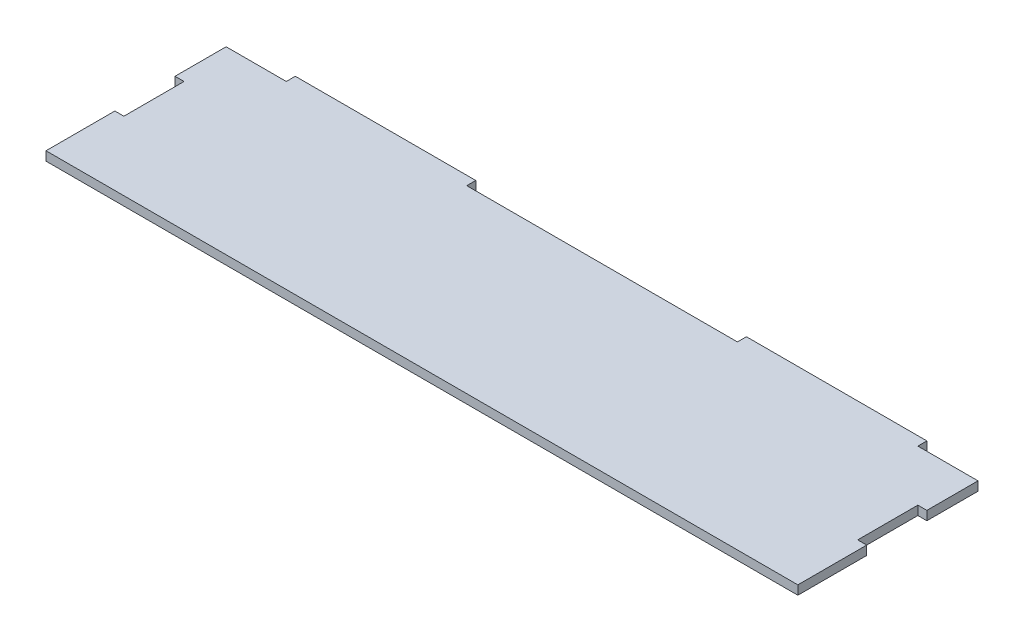
ISO-10303-21;
HEADER;
FILE_DESCRIPTION(('STEP AP214'),'2;1');
FILE_NAME('part.step','',(''),(''),'','','');
FILE_SCHEMA(('AUTOMOTIVE_DESIGN { 1 0 10303 214 1 1 1 1 }'));
ENDSEC;
DATA;
#1=APPLICATION_CONTEXT('core data for automotive mechanical design processes');
#2=APPLICATION_PROTOCOL_DEFINITION('international standard','automotive_design',2000,#1);
#3=PRODUCT_CONTEXT('',#1,'mechanical');
#4=PRODUCT('Part','Part','',(#3));
#5=PRODUCT_RELATED_PRODUCT_CATEGORY('part','',(#4));
#6=PRODUCT_DEFINITION_FORMATION('','',#4);
#7=PRODUCT_DEFINITION_CONTEXT('part definition',#1,'design');
#8=PRODUCT_DEFINITION('design','',#6,#7);
#9=PRODUCT_DEFINITION_SHAPE('','',#8);
#10=(LENGTH_UNIT() NAMED_UNIT(*) SI_UNIT(.MILLI.,.METRE.));
#11=(NAMED_UNIT(*) PLANE_ANGLE_UNIT() SI_UNIT($,.RADIAN.));
#12=(NAMED_UNIT(*) SI_UNIT($,.STERADIAN.) SOLID_ANGLE_UNIT());
#13=UNCERTAINTY_MEASURE_WITH_UNIT(LENGTH_MEASURE(1.E-05),#10,'distance_accuracy_value','');
#14=(GEOMETRIC_REPRESENTATION_CONTEXT(3) GLOBAL_UNCERTAINTY_ASSIGNED_CONTEXT((#13)) GLOBAL_UNIT_ASSIGNED_CONTEXT((#10,
#11,#12)) REPRESENTATION_CONTEXT('',''));
#15=CARTESIAN_POINT('',(0.,0.,0.));
#16=DIRECTION('',(0.,0.,1.));
#17=DIRECTION('',(1.,0.,0.));
#18=AXIS2_PLACEMENT_3D('',#15,#16,#17);
#19=CARTESIAN_POINT('',(0.,3.,-62.9));
#20=DIRECTION('',(0.,0.,1.));
#21=DIRECTION('',(1.,0.,0.));
#22=AXIS2_PLACEMENT_3D('',#19,#20,#21);
#23=PLANE('',#22);
#24=DIRECTION('',(-1.,0.,0.));
#25=VECTOR('',#24,1.);
#26=CARTESIAN_POINT('',(0.,3.,-62.9));
#27=LINE('',#26,#25);
#28=CARTESIAN_POINT('',(80.,3.,-62.9));
#29=VERTEX_POINT('',#28);
#30=CARTESIAN_POINT('',(20.,3.,-62.9));
#31=VERTEX_POINT('',#30);
#32=EDGE_CURVE('E209',#29,#31,#27,.T.);
#33=ORIENTED_EDGE('',*,*,#32,.F.);
#34=DIRECTION('',(0.,1.,0.));
#35=VECTOR('',#34,1.);
#36=CARTESIAN_POINT('',(80.,-0.00100000000000013,-62.9));
#37=LINE('',#36,#35);
#38=CARTESIAN_POINT('',(80.,0.,-62.9));
#39=VERTEX_POINT('',#38);
#40=EDGE_CURVE('E180',#39,#29,#37,.T.);
#41=ORIENTED_EDGE('',*,*,#40,.F.);
#42=DIRECTION('',(-1.,0.,0.));
#43=VECTOR('',#42,1.);
#44=CARTESIAN_POINT('',(0.,0.,-62.9));
#45=LINE('',#44,#43);
#46=CARTESIAN_POINT('',(20.,0.,-62.9));
#47=VERTEX_POINT('',#46);
#48=EDGE_CURVE('E195',#39,#47,#45,.T.);
#49=ORIENTED_EDGE('',*,*,#48,.T.);
#50=DIRECTION('',(0.,1.,0.));
#51=VECTOR('',#50,1.);
#52=CARTESIAN_POINT('',(20.,-0.00100000000000013,-62.9));
#53=LINE('',#52,#51);
#54=EDGE_CURVE('E325',#47,#31,#53,.T.);
#55=ORIENTED_EDGE('',*,*,#54,.T.);
#56=EDGE_LOOP('',(#33,#41,#49,#55));
#57=FACE_BOUND('',#56,.T.);
#58=ADVANCED_FACE('F33',(#57),#23,.F.);
#59=CARTESIAN_POINT('',(250.,3.,0.));
#60=DIRECTION('',(-1.,0.,0.));
#61=DIRECTION('',(0.,0.,1.));
#62=AXIS2_PLACEMENT_3D('',#59,#60,#61);
#63=PLANE('',#62);
#64=DIRECTION('',(0.,0.,-1.));
#65=VECTOR('',#64,1.);
#66=CARTESIAN_POINT('',(250.,0.,0.));
#67=LINE('',#66,#65);
#68=CARTESIAN_POINT('',(250.,0.,0.));
#69=VERTEX_POINT('',#68);
#70=CARTESIAN_POINT('',(250.,0.,-22.9));
#71=VERTEX_POINT('',#70);
#72=EDGE_CURVE('E199',#69,#71,#67,.T.);
#73=ORIENTED_EDGE('',*,*,#72,.T.);
#74=DIRECTION('',(0.,1.,0.));
#75=VECTOR('',#74,1.);
#76=CARTESIAN_POINT('',(250.,0.,-22.9));
#77=LINE('',#76,#75);
#78=CARTESIAN_POINT('',(250.,3.,-22.9));
#79=VERTEX_POINT('',#78);
#80=EDGE_CURVE('E230',#71,#79,#77,.T.);
#81=ORIENTED_EDGE('',*,*,#80,.T.);
#82=DIRECTION('',(0.,0.,-1.));
#83=VECTOR('',#82,1.);
#84=CARTESIAN_POINT('',(250.,3.,0.));
#85=LINE('',#84,#83);
#86=CARTESIAN_POINT('',(250.,3.,0.));
#87=VERTEX_POINT('',#86);
#88=EDGE_CURVE('E213',#87,#79,#85,.T.);
#89=ORIENTED_EDGE('',*,*,#88,.F.);
#90=DIRECTION('',(0.,-1.,0.));
#91=VECTOR('',#90,1.);
#92=CARTESIAN_POINT('',(250.,3.,0.));
#93=LINE('',#92,#91);
#94=EDGE_CURVE('E41',#87,#69,#93,.T.);
#95=ORIENTED_EDGE('',*,*,#94,.T.);
#96=EDGE_LOOP('',(#73,#81,#89,#95));
#97=FACE_BOUND('',#96,.T.);
#98=ADVANCED_FACE('F229',(#97),#63,.F.);
#99=CARTESIAN_POINT('',(0.,3.,0.));
#100=DIRECTION('',(1.,0.,0.));
#101=DIRECTION('',(0.,0.,-1.));
#102=AXIS2_PLACEMENT_3D('',#99,#100,#101);
#103=PLANE('',#102);
#104=DIRECTION('',(0.,0.,1.));
#105=VECTOR('',#104,1.);
#106=CARTESIAN_POINT('',(0.,3.,0.));
#107=LINE('',#106,#105);
#108=CARTESIAN_POINT('',(0.,3.,-59.9));
#109=VERTEX_POINT('',#108);
#110=CARTESIAN_POINT('',(0.,3.,-42.9));
#111=VERTEX_POINT('',#110);
#112=EDGE_CURVE('E197',#109,#111,#107,.T.);
#113=ORIENTED_EDGE('',*,*,#112,.F.);
#114=DIRECTION('',(0.,1.,0.));
#115=VECTOR('',#114,1.);
#116=CARTESIAN_POINT('',(0.,-0.00100000000000013,-59.9));
#117=LINE('',#116,#115);
#118=CARTESIAN_POINT('',(0.,0.,-59.9));
#119=VERTEX_POINT('',#118);
#120=EDGE_CURVE('E324',#119,#109,#117,.T.);
#121=ORIENTED_EDGE('',*,*,#120,.F.);
#122=DIRECTION('',(0.,0.,1.));
#123=VECTOR('',#122,1.);
#124=CARTESIAN_POINT('',(0.,0.,0.));
#125=LINE('',#124,#123);
#126=CARTESIAN_POINT('',(0.,0.,-42.9));
#127=VERTEX_POINT('',#126);
#128=EDGE_CURVE('E217',#119,#127,#125,.T.);
#129=ORIENTED_EDGE('',*,*,#128,.T.);
#130=DIRECTION('',(0.,1.,0.));
#131=VECTOR('',#130,1.);
#132=CARTESIAN_POINT('',(0.,0.,-42.9));
#133=LINE('',#132,#131);
#134=EDGE_CURVE('E280',#127,#111,#133,.T.);
#135=ORIENTED_EDGE('',*,*,#134,.T.);
#136=EDGE_LOOP('',(#113,#121,#129,#135));
#137=FACE_BOUND('',#136,.T.);
#138=ADVANCED_FACE('F369',(#137),#103,.F.);
#139=CARTESIAN_POINT('',(0.,3.,-22.9));
#140=VERTEX_POINT('',#139);
#141=CARTESIAN_POINT('',(0.,3.,0.));
#142=VERTEX_POINT('',#141);
#143=EDGE_CURVE('E194',#140,#142,#107,.T.);
#144=ORIENTED_EDGE('',*,*,#143,.F.);
#145=DIRECTION('',(0.,1.,0.));
#146=VECTOR('',#145,1.);
#147=CARTESIAN_POINT('',(0.,0.,-22.9));
#148=LINE('',#147,#146);
#149=CARTESIAN_POINT('',(0.,0.,-22.9));
#150=VERTEX_POINT('',#149);
#151=EDGE_CURVE('E272',#150,#140,#148,.T.);
#152=ORIENTED_EDGE('',*,*,#151,.F.);
#153=CARTESIAN_POINT('',(0.,0.,0.));
#154=VERTEX_POINT('',#153);
#155=EDGE_CURVE('E219',#150,#154,#125,.T.);
#156=ORIENTED_EDGE('',*,*,#155,.T.);
#157=DIRECTION('',(0.,-1.,0.));
#158=VECTOR('',#157,1.);
#159=CARTESIAN_POINT('',(0.,3.,0.));
#160=LINE('',#159,#158);
#161=EDGE_CURVE('E11',#142,#154,#160,.T.);
#162=ORIENTED_EDGE('',*,*,#161,.F.);
#163=EDGE_LOOP('',(#144,#152,#156,#162));
#164=FACE_BOUND('',#163,.T.);
#165=ADVANCED_FACE('F35',(#164),#103,.F.);
#166=CARTESIAN_POINT('',(0.,3.,0.));
#167=DIRECTION('',(0.,0.,-1.));
#168=DIRECTION('',(-1.,0.,0.));
#169=AXIS2_PLACEMENT_3D('',#166,#167,#168);
#170=PLANE('',#169);
#171=DIRECTION('',(1.,0.,0.));
#172=VECTOR('',#171,1.);
#173=CARTESIAN_POINT('',(0.,0.,0.));
#174=LINE('',#173,#172);
#175=EDGE_CURVE('E218',#154,#69,#174,.T.);
#176=ORIENTED_EDGE('',*,*,#175,.T.);
#177=ORIENTED_EDGE('',*,*,#94,.F.);
#178=DIRECTION('',(1.,0.,0.));
#179=VECTOR('',#178,1.);
#180=CARTESIAN_POINT('',(0.,3.,0.));
#181=LINE('',#180,#179);
#182=EDGE_CURVE('E287',#142,#87,#181,.T.);
#183=ORIENTED_EDGE('',*,*,#182,.F.);
#184=ORIENTED_EDGE('',*,*,#161,.T.);
#185=EDGE_LOOP('',(#176,#177,#183,#184));
#186=FACE_BOUND('',#185,.T.);
#187=ADVANCED_FACE('F386',(#186),#170,.F.);
#188=CARTESIAN_POINT('',(250.,0.,-42.9));
#189=VERTEX_POINT('',#188);
#190=CARTESIAN_POINT('',(250.,0.,-59.9));
#191=VERTEX_POINT('',#190);
#192=EDGE_CURVE('E220',#189,#191,#67,.T.);
#193=ORIENTED_EDGE('',*,*,#192,.T.);
#194=DIRECTION('',(0.,1.,0.));
#195=VECTOR('',#194,1.);
#196=CARTESIAN_POINT('',(250.,-0.00100000000000013,-59.9));
#197=LINE('',#196,#195);
#198=CARTESIAN_POINT('',(250.,3.,-59.9));
#199=VERTEX_POINT('',#198);
#200=EDGE_CURVE('E305',#191,#199,#197,.T.);
#201=ORIENTED_EDGE('',*,*,#200,.T.);
#202=CARTESIAN_POINT('',(250.,3.,-42.9));
#203=VERTEX_POINT('',#202);
#204=EDGE_CURVE('E288',#203,#199,#85,.T.);
#205=ORIENTED_EDGE('',*,*,#204,.F.);
#206=DIRECTION('',(0.,1.,0.));
#207=VECTOR('',#206,1.);
#208=CARTESIAN_POINT('',(250.,0.,-42.9));
#209=LINE('',#208,#207);
#210=EDGE_CURVE('E240',#189,#203,#209,.T.);
#211=ORIENTED_EDGE('',*,*,#210,.F.);
#212=EDGE_LOOP('',(#193,#201,#205,#211));
#213=FACE_BOUND('',#212,.T.);
#214=ADVANCED_FACE('F304',(#213),#63,.F.);
#215=CARTESIAN_POINT('',(230.,0.,-62.9));
#216=VERTEX_POINT('',#215);
#217=CARTESIAN_POINT('',(170.,0.,-62.9));
#218=VERTEX_POINT('',#217);
#219=EDGE_CURVE('E187',#216,#218,#45,.T.);
#220=ORIENTED_EDGE('',*,*,#219,.T.);
#221=DIRECTION('',(0.,1.,0.));
#222=VECTOR('',#221,1.);
#223=CARTESIAN_POINT('',(170.,-0.00100000000000013,-62.9));
#224=LINE('',#223,#222);
#225=CARTESIAN_POINT('',(170.,3.,-62.9));
#226=VERTEX_POINT('',#225);
#227=EDGE_CURVE('E169',#218,#226,#224,.T.);
#228=ORIENTED_EDGE('',*,*,#227,.T.);
#229=CARTESIAN_POINT('',(230.,3.,-62.9));
#230=VERTEX_POINT('',#229);
#231=EDGE_CURVE('E203',#230,#226,#27,.T.);
#232=ORIENTED_EDGE('',*,*,#231,.F.);
#233=DIRECTION('',(0.,1.,0.));
#234=VECTOR('',#233,1.);
#235=CARTESIAN_POINT('',(230.,-0.00100000000000013,-62.9));
#236=LINE('',#235,#234);
#237=EDGE_CURVE('E193',#216,#230,#236,.T.);
#238=ORIENTED_EDGE('',*,*,#237,.F.);
#239=EDGE_LOOP('',(#220,#228,#232,#238));
#240=FACE_BOUND('',#239,.T.);
#241=ADVANCED_FACE('F192',(#240),#23,.F.);
#242=CARTESIAN_POINT('',(0.,3.,0.));
#243=DIRECTION('',(0.,-1.,0.));
#244=DIRECTION('',(0.,0.,-1.));
#245=AXIS2_PLACEMENT_3D('',#242,#243,#244);
#246=PLANE('',#245);
#247=DIRECTION('',(1.,0.,0.));
#248=VECTOR('',#247,1.);
#249=CARTESIAN_POINT('',(80.,3.,-59.9));
#250=LINE('',#249,#248);
#251=CARTESIAN_POINT('',(80.,3.,-59.9));
#252=VERTEX_POINT('',#251);
#253=CARTESIAN_POINT('',(170.,3.,-59.9));
#254=VERTEX_POINT('',#253);
#255=EDGE_CURVE('E344',#252,#254,#250,.T.);
#256=ORIENTED_EDGE('',*,*,#255,.F.);
#257=DIRECTION('',(0.,0.,1.));
#258=VECTOR('',#257,1.);
#259=CARTESIAN_POINT('',(80.,3.,-62.9));
#260=LINE('',#259,#258);
#261=EDGE_CURVE('E346',#29,#252,#260,.T.);
#262=ORIENTED_EDGE('',*,*,#261,.F.);
#263=ORIENTED_EDGE('',*,*,#32,.T.);
#264=DIRECTION('',(0.,0.,-1.));
#265=VECTOR('',#264,1.);
#266=CARTESIAN_POINT('',(20.,3.,-62.9));
#267=LINE('',#266,#265);
#268=CARTESIAN_POINT('',(20.,3.,-59.9));
#269=VERTEX_POINT('',#268);
#270=EDGE_CURVE('E321',#269,#31,#267,.T.);
#271=ORIENTED_EDGE('',*,*,#270,.F.);
#272=DIRECTION('',(1.,0.,0.));
#273=VECTOR('',#272,1.);
#274=CARTESIAN_POINT('',(0.,3.,-59.9));
#275=LINE('',#274,#273);
#276=EDGE_CURVE('E311',#109,#269,#275,.T.);
#277=ORIENTED_EDGE('',*,*,#276,.F.);
#278=ORIENTED_EDGE('',*,*,#112,.T.);
#279=DIRECTION('',(-1.,0.,0.));
#280=VECTOR('',#279,1.);
#281=CARTESIAN_POINT('',(0.,3.,-42.9));
#282=LINE('',#281,#280);
#283=CARTESIAN_POINT('',(3.,3.,-42.9));
#284=VERTEX_POINT('',#283);
#285=EDGE_CURVE('E266',#284,#111,#282,.T.);
#286=ORIENTED_EDGE('',*,*,#285,.F.);
#287=DIRECTION('',(0.,0.,-1.));
#288=VECTOR('',#287,1.);
#289=CARTESIAN_POINT('',(3.,3.,-42.9));
#290=LINE('',#289,#288);
#291=CARTESIAN_POINT('',(3.,3.,-22.9));
#292=VERTEX_POINT('',#291);
#293=EDGE_CURVE('E275',#292,#284,#290,.T.);
#294=ORIENTED_EDGE('',*,*,#293,.F.);
#295=DIRECTION('',(1.,0.,0.));
#296=VECTOR('',#295,1.);
#297=CARTESIAN_POINT('',(0.,3.,-22.9));
#298=LINE('',#297,#296);
#299=EDGE_CURVE('E258',#140,#292,#298,.T.);
#300=ORIENTED_EDGE('',*,*,#299,.F.);
#301=ORIENTED_EDGE('',*,*,#143,.T.);
#302=ORIENTED_EDGE('',*,*,#182,.T.);
#303=ORIENTED_EDGE('',*,*,#88,.T.);
#304=DIRECTION('',(1.,0.,0.));
#305=VECTOR('',#304,1.);
#306=CARTESIAN_POINT('',(250.,3.,-22.9));
#307=LINE('',#306,#305);
#308=CARTESIAN_POINT('',(247.,3.,-22.9));
#309=VERTEX_POINT('',#308);
#310=EDGE_CURVE('E255',#309,#79,#307,.T.);
#311=ORIENTED_EDGE('',*,*,#310,.F.);
#312=DIRECTION('',(0.,0.,1.));
#313=VECTOR('',#312,1.);
#314=CARTESIAN_POINT('',(247.,3.,-42.9));
#315=LINE('',#314,#313);
#316=CARTESIAN_POINT('',(247.,3.,-42.9));
#317=VERTEX_POINT('',#316);
#318=EDGE_CURVE('E251',#317,#309,#315,.T.);
#319=ORIENTED_EDGE('',*,*,#318,.F.);
#320=DIRECTION('',(-1.,0.,0.));
#321=VECTOR('',#320,1.);
#322=CARTESIAN_POINT('',(250.,3.,-42.9));
#323=LINE('',#322,#321);
#324=EDGE_CURVE('E248',#203,#317,#323,.T.);
#325=ORIENTED_EDGE('',*,*,#324,.F.);
#326=ORIENTED_EDGE('',*,*,#204,.T.);
#327=DIRECTION('',(1.,0.,0.));
#328=VECTOR('',#327,1.);
#329=CARTESIAN_POINT('',(250.,3.,-59.9));
#330=LINE('',#329,#328);
#331=CARTESIAN_POINT('',(230.,3.,-59.9));
#332=VERTEX_POINT('',#331);
#333=EDGE_CURVE('E315',#332,#199,#330,.T.);
#334=ORIENTED_EDGE('',*,*,#333,.F.);
#335=DIRECTION('',(0.,0.,1.));
#336=VECTOR('',#335,1.);
#337=CARTESIAN_POINT('',(230.,3.,-62.9));
#338=LINE('',#337,#336);
#339=EDGE_CURVE('E334',#230,#332,#338,.T.);
#340=ORIENTED_EDGE('',*,*,#339,.F.);
#341=ORIENTED_EDGE('',*,*,#231,.T.);
#342=DIRECTION('',(0.,0.,-1.));
#343=VECTOR('',#342,1.);
#344=CARTESIAN_POINT('',(170.,3.,-62.9));
#345=LINE('',#344,#343);
#346=EDGE_CURVE('E175',#254,#226,#345,.T.);
#347=ORIENTED_EDGE('',*,*,#346,.F.);
#348=EDGE_LOOP('',(#256,#262,#263,#271,#277,#278,#286,#294,#300,#301,#302,#303,#311,#319,#325,
#326,#334,#340,#341,#347));
#349=FACE_BOUND('',#348,.T.);
#350=ADVANCED_FACE('F296',(#349),#246,.F.);
#351=CARTESIAN_POINT('',(0.,0.,0.));
#352=DIRECTION('',(0.,-1.,0.));
#353=DIRECTION('',(0.,0.,-1.));
#354=AXIS2_PLACEMENT_3D('',#351,#352,#353);
#355=PLANE('',#354);
#356=DIRECTION('',(0.,0.,1.));
#357=VECTOR('',#356,1.);
#358=CARTESIAN_POINT('',(80.,0.,-62.9));
#359=LINE('',#358,#357);
#360=CARTESIAN_POINT('',(80.,0.,-59.9));
#361=VERTEX_POINT('',#360);
#362=EDGE_CURVE('E189',#39,#361,#359,.T.);
#363=ORIENTED_EDGE('',*,*,#362,.T.);
#364=DIRECTION('',(1.,0.,0.));
#365=VECTOR('',#364,1.);
#366=CARTESIAN_POINT('',(80.,0.,-59.9));
#367=LINE('',#366,#365);
#368=CARTESIAN_POINT('',(170.,0.,-59.9));
#369=VERTEX_POINT('',#368);
#370=EDGE_CURVE('E188',#361,#369,#367,.T.);
#371=ORIENTED_EDGE('',*,*,#370,.T.);
#372=DIRECTION('',(0.,0.,-1.));
#373=VECTOR('',#372,1.);
#374=CARTESIAN_POINT('',(170.,0.,-62.9));
#375=LINE('',#374,#373);
#376=EDGE_CURVE('E172',#369,#218,#375,.T.);
#377=ORIENTED_EDGE('',*,*,#376,.T.);
#378=ORIENTED_EDGE('',*,*,#219,.F.);
#379=DIRECTION('',(0.,0.,1.));
#380=VECTOR('',#379,1.);
#381=CARTESIAN_POINT('',(230.,0.,-62.9));
#382=LINE('',#381,#380);
#383=CARTESIAN_POINT('',(230.,0.,-59.9));
#384=VERTEX_POINT('',#383);
#385=EDGE_CURVE('E333',#216,#384,#382,.T.);
#386=ORIENTED_EDGE('',*,*,#385,.T.);
#387=DIRECTION('',(1.,0.,0.));
#388=VECTOR('',#387,1.);
#389=CARTESIAN_POINT('',(250.,0.,-59.9));
#390=LINE('',#389,#388);
#391=EDGE_CURVE('E332',#384,#191,#390,.T.);
#392=ORIENTED_EDGE('',*,*,#391,.T.);
#393=ORIENTED_EDGE('',*,*,#192,.F.);
#394=DIRECTION('',(-1.,0.,0.));
#395=VECTOR('',#394,1.);
#396=CARTESIAN_POINT('',(250.,0.,-42.9));
#397=LINE('',#396,#395);
#398=CARTESIAN_POINT('',(247.,0.,-42.9));
#399=VERTEX_POINT('',#398);
#400=EDGE_CURVE('E244',#189,#399,#397,.T.);
#401=ORIENTED_EDGE('',*,*,#400,.T.);
#402=DIRECTION('',(0.,0.,1.));
#403=VECTOR('',#402,1.);
#404=CARTESIAN_POINT('',(247.,0.,-42.9));
#405=LINE('',#404,#403);
#406=CARTESIAN_POINT('',(247.,0.,-22.9));
#407=VERTEX_POINT('',#406);
#408=EDGE_CURVE('E238',#399,#407,#405,.T.);
#409=ORIENTED_EDGE('',*,*,#408,.T.);
#410=DIRECTION('',(1.,0.,0.));
#411=VECTOR('',#410,1.);
#412=CARTESIAN_POINT('',(250.,0.,-22.9));
#413=LINE('',#412,#411);
#414=EDGE_CURVE('E236',#407,#71,#413,.T.);
#415=ORIENTED_EDGE('',*,*,#414,.T.);
#416=ORIENTED_EDGE('',*,*,#72,.F.);
#417=ORIENTED_EDGE('',*,*,#175,.F.);
#418=ORIENTED_EDGE('',*,*,#155,.F.);
#419=DIRECTION('',(1.,0.,0.));
#420=VECTOR('',#419,1.);
#421=CARTESIAN_POINT('',(0.,0.,-22.9));
#422=LINE('',#421,#420);
#423=CARTESIAN_POINT('',(3.,0.,-22.9));
#424=VERTEX_POINT('',#423);
#425=EDGE_CURVE('E262',#150,#424,#422,.T.);
#426=ORIENTED_EDGE('',*,*,#425,.T.);
#427=DIRECTION('',(0.,0.,-1.));
#428=VECTOR('',#427,1.);
#429=CARTESIAN_POINT('',(3.,0.,-42.9));
#430=LINE('',#429,#428);
#431=CARTESIAN_POINT('',(3.,0.,-42.9));
#432=VERTEX_POINT('',#431);
#433=EDGE_CURVE('E265',#424,#432,#430,.T.);
#434=ORIENTED_EDGE('',*,*,#433,.T.);
#435=DIRECTION('',(-1.,0.,0.));
#436=VECTOR('',#435,1.);
#437=CARTESIAN_POINT('',(0.,0.,-42.9));
#438=LINE('',#437,#436);
#439=EDGE_CURVE('E269',#432,#127,#438,.T.);
#440=ORIENTED_EDGE('',*,*,#439,.T.);
#441=ORIENTED_EDGE('',*,*,#128,.F.);
#442=DIRECTION('',(1.,0.,0.));
#443=VECTOR('',#442,1.);
#444=CARTESIAN_POINT('',(0.,0.,-59.9));
#445=LINE('',#444,#443);
#446=CARTESIAN_POINT('',(20.,0.,-59.9));
#447=VERTEX_POINT('',#446);
#448=EDGE_CURVE('E252',#119,#447,#445,.T.);
#449=ORIENTED_EDGE('',*,*,#448,.T.);
#450=DIRECTION('',(0.,0.,-1.));
#451=VECTOR('',#450,1.);
#452=CARTESIAN_POINT('',(20.,0.,-62.9));
#453=LINE('',#452,#451);
#454=EDGE_CURVE('E308',#447,#47,#453,.T.);
#455=ORIENTED_EDGE('',*,*,#454,.T.);
#456=ORIENTED_EDGE('',*,*,#48,.F.);
#457=EDGE_LOOP('',(#363,#371,#377,#378,#386,#392,#393,#401,#409,#415,#416,#417,#418,#426,#434,
#440,#441,#449,#455,#456));
#458=FACE_BOUND('',#457,.T.);
#459=ADVANCED_FACE('F185',(#458),#355,.T.);
#460=CARTESIAN_POINT('',(0.,0.,-42.9));
#461=DIRECTION('',(0.,0.,-1.));
#462=DIRECTION('',(-1.,0.,0.));
#463=AXIS2_PLACEMENT_3D('',#460,#461,#462);
#464=PLANE('',#463);
#465=ORIENTED_EDGE('',*,*,#285,.T.);
#466=ORIENTED_EDGE('',*,*,#134,.F.);
#467=ORIENTED_EDGE('',*,*,#439,.F.);
#468=DIRECTION('',(0.,1.,0.));
#469=VECTOR('',#468,1.);
#470=CARTESIAN_POINT('',(3.,0.,-42.9));
#471=LINE('',#470,#469);
#472=EDGE_CURVE('E283',#432,#284,#471,.T.);
#473=ORIENTED_EDGE('',*,*,#472,.T.);
#474=EDGE_LOOP('',(#465,#466,#467,#473));
#475=FACE_BOUND('',#474,.T.);
#476=ADVANCED_FACE('F374',(#475),#464,.F.);
#477=CARTESIAN_POINT('',(3.,0.,-42.9));
#478=DIRECTION('',(1.,0.,0.));
#479=DIRECTION('',(0.,0.,-1.));
#480=AXIS2_PLACEMENT_3D('',#477,#478,#479);
#481=PLANE('',#480);
#482=ORIENTED_EDGE('',*,*,#293,.T.);
#483=ORIENTED_EDGE('',*,*,#472,.F.);
#484=ORIENTED_EDGE('',*,*,#433,.F.);
#485=DIRECTION('',(0.,1.,0.));
#486=VECTOR('',#485,1.);
#487=CARTESIAN_POINT('',(3.,0.,-22.9));
#488=LINE('',#487,#486);
#489=EDGE_CURVE('E285',#424,#292,#488,.T.);
#490=ORIENTED_EDGE('',*,*,#489,.T.);
#491=EDGE_LOOP('',(#482,#483,#484,#490));
#492=FACE_BOUND('',#491,.T.);
#493=ADVANCED_FACE('F377',(#492),#481,.F.);
#494=CARTESIAN_POINT('',(0.,0.,-22.9));
#495=DIRECTION('',(0.,0.,1.));
#496=DIRECTION('',(1.,0.,0.));
#497=AXIS2_PLACEMENT_3D('',#494,#495,#496);
#498=PLANE('',#497);
#499=ORIENTED_EDGE('',*,*,#299,.T.);
#500=ORIENTED_EDGE('',*,*,#489,.F.);
#501=ORIENTED_EDGE('',*,*,#425,.F.);
#502=ORIENTED_EDGE('',*,*,#151,.T.);
#503=EDGE_LOOP('',(#499,#500,#501,#502));
#504=FACE_BOUND('',#503,.T.);
#505=ADVANCED_FACE('F379',(#504),#498,.F.);
#506=CARTESIAN_POINT('',(250.,0.,-22.9));
#507=DIRECTION('',(0.,0.,1.));
#508=DIRECTION('',(1.,0.,0.));
#509=AXIS2_PLACEMENT_3D('',#506,#507,#508);
#510=PLANE('',#509);
#511=ORIENTED_EDGE('',*,*,#310,.T.);
#512=ORIENTED_EDGE('',*,*,#80,.F.);
#513=ORIENTED_EDGE('',*,*,#414,.F.);
#514=DIRECTION('',(0.,1.,0.));
#515=VECTOR('',#514,1.);
#516=CARTESIAN_POINT('',(247.,0.,-22.9));
#517=LINE('',#516,#515);
#518=EDGE_CURVE('E259',#407,#309,#517,.T.);
#519=ORIENTED_EDGE('',*,*,#518,.T.);
#520=EDGE_LOOP('',(#511,#512,#513,#519));
#521=FACE_BOUND('',#520,.T.);
#522=ADVANCED_FACE('F298',(#521),#510,.F.);
#523=CARTESIAN_POINT('',(247.,0.,-42.9));
#524=DIRECTION('',(-1.,0.,0.));
#525=DIRECTION('',(0.,0.,1.));
#526=AXIS2_PLACEMENT_3D('',#523,#524,#525);
#527=PLANE('',#526);
#528=ORIENTED_EDGE('',*,*,#318,.T.);
#529=ORIENTED_EDGE('',*,*,#518,.F.);
#530=ORIENTED_EDGE('',*,*,#408,.F.);
#531=DIRECTION('',(0.,1.,0.));
#532=VECTOR('',#531,1.);
#533=CARTESIAN_POINT('',(247.,0.,-42.9));
#534=LINE('',#533,#532);
#535=EDGE_CURVE('E242',#399,#317,#534,.T.);
#536=ORIENTED_EDGE('',*,*,#535,.T.);
#537=EDGE_LOOP('',(#528,#529,#530,#536));
#538=FACE_BOUND('',#537,.T.);
#539=ADVANCED_FACE('F300',(#538),#527,.F.);
#540=CARTESIAN_POINT('',(250.,0.,-42.9));
#541=DIRECTION('',(0.,0.,-1.));
#542=DIRECTION('',(-1.,0.,0.));
#543=AXIS2_PLACEMENT_3D('',#540,#541,#542);
#544=PLANE('',#543);
#545=ORIENTED_EDGE('',*,*,#324,.T.);
#546=ORIENTED_EDGE('',*,*,#535,.F.);
#547=ORIENTED_EDGE('',*,*,#400,.F.);
#548=ORIENTED_EDGE('',*,*,#210,.T.);
#549=EDGE_LOOP('',(#545,#546,#547,#548));
#550=FACE_BOUND('',#549,.T.);
#551=ADVANCED_FACE('F303',(#550),#544,.F.);
#552=CARTESIAN_POINT('',(20.,-0.00100000000000013,-62.9));
#553=DIRECTION('',(1.,0.,0.));
#554=DIRECTION('',(0.,0.,-1.));
#555=AXIS2_PLACEMENT_3D('',#552,#553,#554);
#556=PLANE('',#555);
#557=DIRECTION('',(0.,1.,0.));
#558=VECTOR('',#557,1.);
#559=CARTESIAN_POINT('',(20.,-0.00100000000000013,-59.9));
#560=LINE('',#559,#558);
#561=EDGE_CURVE('E328',#447,#269,#560,.T.);
#562=ORIENTED_EDGE('',*,*,#561,.T.);
#563=ORIENTED_EDGE('',*,*,#270,.T.);
#564=ORIENTED_EDGE('',*,*,#54,.F.);
#565=ORIENTED_EDGE('',*,*,#454,.F.);
#566=EDGE_LOOP('',(#562,#563,#564,#565));
#567=FACE_BOUND('',#566,.T.);
#568=ADVANCED_FACE('F361',(#567),#556,.F.);
#569=CARTESIAN_POINT('',(0.,-0.00100000000000013,-59.9));
#570=DIRECTION('',(0.,0.,1.));
#571=DIRECTION('',(1.,0.,0.));
#572=AXIS2_PLACEMENT_3D('',#569,#570,#571);
#573=PLANE('',#572);
#574=ORIENTED_EDGE('',*,*,#120,.T.);
#575=ORIENTED_EDGE('',*,*,#276,.T.);
#576=ORIENTED_EDGE('',*,*,#561,.F.);
#577=ORIENTED_EDGE('',*,*,#448,.F.);
#578=EDGE_LOOP('',(#574,#575,#576,#577));
#579=FACE_BOUND('',#578,.T.);
#580=ADVANCED_FACE('F364',(#579),#573,.F.);
#581=CARTESIAN_POINT('',(250.,-0.00100000000000013,-59.9));
#582=DIRECTION('',(0.,0.,1.));
#583=DIRECTION('',(1.,0.,0.));
#584=AXIS2_PLACEMENT_3D('',#581,#582,#583);
#585=PLANE('',#584);
#586=DIRECTION('',(0.,1.,0.));
#587=VECTOR('',#586,1.);
#588=CARTESIAN_POINT('',(230.,-0.00100000000000013,-59.9));
#589=LINE('',#588,#587);
#590=EDGE_CURVE('E56',#384,#332,#589,.T.);
#591=ORIENTED_EDGE('',*,*,#590,.T.);
#592=ORIENTED_EDGE('',*,*,#333,.T.);
#593=ORIENTED_EDGE('',*,*,#200,.F.);
#594=ORIENTED_EDGE('',*,*,#391,.F.);
#595=EDGE_LOOP('',(#591,#592,#593,#594));
#596=FACE_BOUND('',#595,.T.);
#597=ADVANCED_FACE('F425',(#596),#585,.F.);
#598=CARTESIAN_POINT('',(230.,-0.00100000000000013,-62.9));
#599=DIRECTION('',(-1.,0.,0.));
#600=DIRECTION('',(0.,0.,1.));
#601=AXIS2_PLACEMENT_3D('',#598,#599,#600);
#602=PLANE('',#601);
#603=ORIENTED_EDGE('',*,*,#237,.T.);
#604=ORIENTED_EDGE('',*,*,#339,.T.);
#605=ORIENTED_EDGE('',*,*,#590,.F.);
#606=ORIENTED_EDGE('',*,*,#385,.F.);
#607=EDGE_LOOP('',(#603,#604,#605,#606));
#608=FACE_BOUND('',#607,.T.);
#609=ADVANCED_FACE('F428',(#608),#602,.F.);
#610=CARTESIAN_POINT('',(80.,-0.00100000000000013,-62.9));
#611=DIRECTION('',(-1.,0.,0.));
#612=DIRECTION('',(0.,0.,1.));
#613=AXIS2_PLACEMENT_3D('',#610,#611,#612);
#614=PLANE('',#613);
#615=ORIENTED_EDGE('',*,*,#40,.T.);
#616=ORIENTED_EDGE('',*,*,#261,.T.);
#617=DIRECTION('',(0.,1.,0.));
#618=VECTOR('',#617,1.);
#619=CARTESIAN_POINT('',(80.,-0.00100000000000013,-59.9));
#620=LINE('',#619,#618);
#621=EDGE_CURVE('E339',#361,#252,#620,.T.);
#622=ORIENTED_EDGE('',*,*,#621,.F.);
#623=ORIENTED_EDGE('',*,*,#362,.F.);
#624=EDGE_LOOP('',(#615,#616,#622,#623));
#625=FACE_BOUND('',#624,.T.);
#626=ADVANCED_FACE('F353',(#625),#614,.F.);
#627=CARTESIAN_POINT('',(170.,-0.00100000000000013,-62.9));
#628=DIRECTION('',(1.,0.,0.));
#629=DIRECTION('',(0.,0.,-1.));
#630=AXIS2_PLACEMENT_3D('',#627,#628,#629);
#631=PLANE('',#630);
#632=DIRECTION('',(0.,1.,0.));
#633=VECTOR('',#632,1.);
#634=CARTESIAN_POINT('',(170.,-0.00100000000000013,-59.9));
#635=LINE('',#634,#633);
#636=EDGE_CURVE('E48',#369,#254,#635,.T.);
#637=ORIENTED_EDGE('',*,*,#636,.T.);
#638=ORIENTED_EDGE('',*,*,#346,.T.);
#639=ORIENTED_EDGE('',*,*,#227,.F.);
#640=ORIENTED_EDGE('',*,*,#376,.F.);
#641=EDGE_LOOP('',(#637,#638,#639,#640));
#642=FACE_BOUND('',#641,.T.);
#643=ADVANCED_FACE('F171',(#642),#631,.F.);
#644=CARTESIAN_POINT('',(80.,-0.00100000000000013,-59.9));
#645=DIRECTION('',(0.,0.,1.));
#646=DIRECTION('',(1.,0.,0.));
#647=AXIS2_PLACEMENT_3D('',#644,#645,#646);
#648=PLANE('',#647);
#649=ORIENTED_EDGE('',*,*,#621,.T.);
#650=ORIENTED_EDGE('',*,*,#255,.T.);
#651=ORIENTED_EDGE('',*,*,#636,.F.);
#652=ORIENTED_EDGE('',*,*,#370,.F.);
#653=EDGE_LOOP('',(#649,#650,#651,#652));
#654=FACE_BOUND('',#653,.T.);
#655=ADVANCED_FACE('F435',(#654),#648,.F.);
#656=CLOSED_SHELL('',(#58,#98,#138,#165,#187,#214,#241,#350,#459,#476,#493,#505,#522,#539,#551,
#568,#580,#597,#609,#626,#643,#655));
#657=MANIFOLD_SOLID_BREP('B2',#656);
#658=ADVANCED_BREP_SHAPE_REPRESENTATION('',(#18,#657),#14);
#659=SHAPE_DEFINITION_REPRESENTATION(#9,#658);
ENDSEC;
END-ISO-10303-21;
